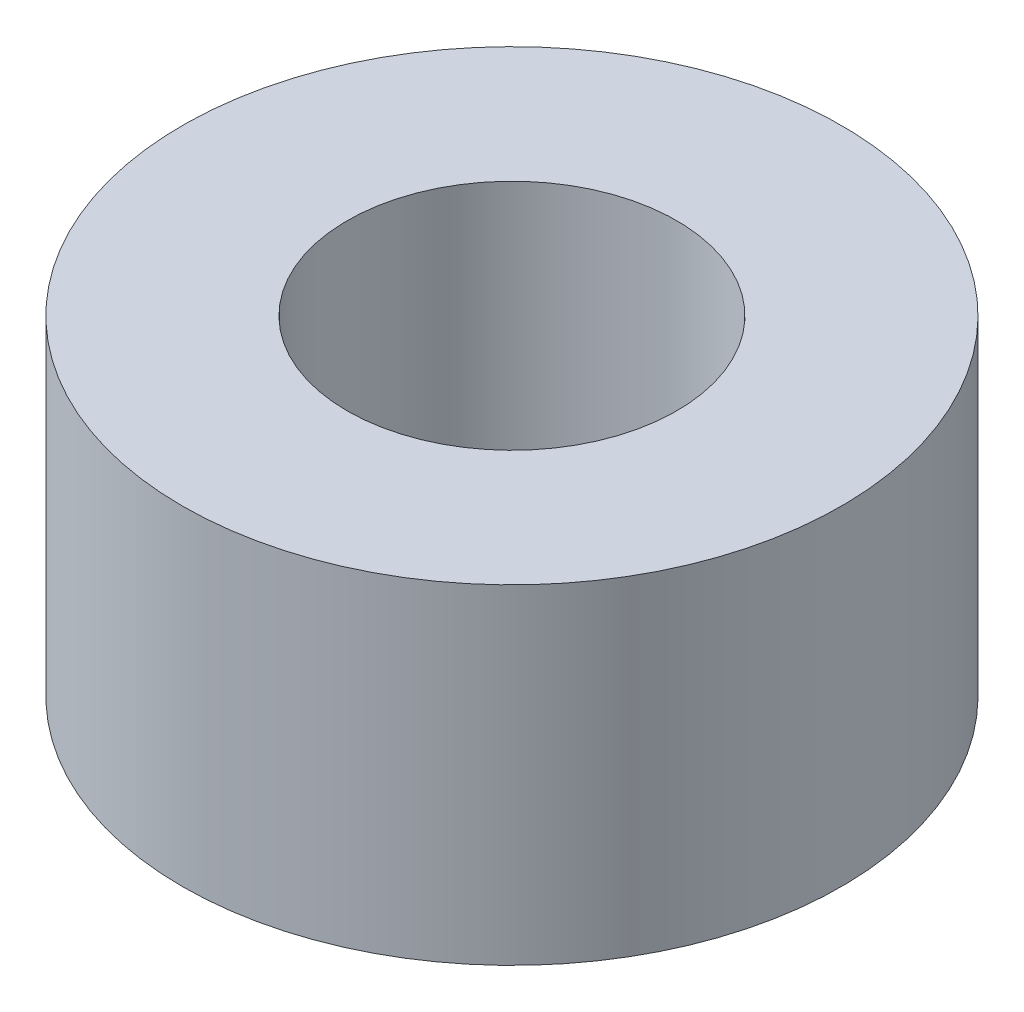
ISO-10303-21;
HEADER;
FILE_DESCRIPTION(('STEP AP214'),'2;1');
FILE_NAME('part.step','',(''),(''),'','','');
FILE_SCHEMA(('AUTOMOTIVE_DESIGN { 1 0 10303 214 1 1 1 1 }'));
ENDSEC;
DATA;
#1=APPLICATION_CONTEXT('core data for automotive mechanical design processes');
#2=APPLICATION_PROTOCOL_DEFINITION('international standard','automotive_design',2000,#1);
#3=PRODUCT_CONTEXT('',#1,'mechanical');
#4=PRODUCT('Part','Part','',(#3));
#5=PRODUCT_RELATED_PRODUCT_CATEGORY('part','',(#4));
#6=PRODUCT_DEFINITION_FORMATION('','',#4);
#7=PRODUCT_DEFINITION_CONTEXT('part definition',#1,'design');
#8=PRODUCT_DEFINITION('design','',#6,#7);
#9=PRODUCT_DEFINITION_SHAPE('','',#8);
#10=(LENGTH_UNIT() NAMED_UNIT(*) SI_UNIT(.MILLI.,.METRE.));
#11=(NAMED_UNIT(*) PLANE_ANGLE_UNIT() SI_UNIT($,.RADIAN.));
#12=(NAMED_UNIT(*) SI_UNIT($,.STERADIAN.) SOLID_ANGLE_UNIT());
#13=UNCERTAINTY_MEASURE_WITH_UNIT(LENGTH_MEASURE(1.E-05),#10,'distance_accuracy_value','');
#14=(GEOMETRIC_REPRESENTATION_CONTEXT(3) GLOBAL_UNCERTAINTY_ASSIGNED_CONTEXT((#13)) GLOBAL_UNIT_ASSIGNED_CONTEXT((#10,
#11,#12)) REPRESENTATION_CONTEXT('',''));
#15=CARTESIAN_POINT('',(0.,0.,0.));
#16=DIRECTION('',(0.,0.,1.));
#17=DIRECTION('',(1.,0.,0.));
#18=AXIS2_PLACEMENT_3D('',#15,#16,#17);
#19=CARTESIAN_POINT('',(0.,4.,0.));
#20=DIRECTION('',(0.,1.,0.));
#21=DIRECTION('',(0.,0.,1.));
#22=AXIS2_PLACEMENT_3D('',#19,#20,#21);
#23=PLANE('',#22);
#24=CARTESIAN_POINT('',(0.,4.,0.));
#25=DIRECTION('',(0.,1.,0.));
#26=DIRECTION('',(0.,0.,1.));
#27=AXIS2_PLACEMENT_3D('',#24,#25,#26);
#28=CIRCLE('',#27,4.);
#29=CARTESIAN_POINT('',(0.,4.,4.));
#30=VERTEX_POINT('',#29);
#31=EDGE_CURVE('E10',#30,#30,#28,.T.);
#32=ORIENTED_EDGE('',*,*,#31,.T.);
#33=EDGE_LOOP('',(#32));
#34=FACE_BOUND('',#33,.T.);
#35=CARTESIAN_POINT('',(0.,4.,0.));
#36=DIRECTION('',(0.,1.,0.));
#37=DIRECTION('',(0.,0.,1.));
#38=AXIS2_PLACEMENT_3D('',#35,#36,#37);
#39=CIRCLE('',#38,2.);
#40=CARTESIAN_POINT('',(0.,4.,2.));
#41=VERTEX_POINT('',#40);
#42=EDGE_CURVE('E43',#41,#41,#39,.T.);
#43=ORIENTED_EDGE('',*,*,#42,.F.);
#44=EDGE_LOOP('',(#43));
#45=FACE_BOUND('',#44,.T.);
#46=ADVANCED_FACE('F32',(#34,#45),#23,.T.);
#47=CARTESIAN_POINT('',(0.,0.,0.));
#48=DIRECTION('',(0.,1.,0.));
#49=DIRECTION('',(0.,0.,1.));
#50=AXIS2_PLACEMENT_3D('',#47,#48,#49);
#51=PLANE('',#50);
#52=CARTESIAN_POINT('',(0.,0.,0.));
#53=DIRECTION('',(0.,1.,0.));
#54=DIRECTION('',(0.,0.,1.));
#55=AXIS2_PLACEMENT_3D('',#52,#53,#54);
#56=CIRCLE('',#55,4.);
#57=CARTESIAN_POINT('',(0.,0.,4.));
#58=VERTEX_POINT('',#57);
#59=EDGE_CURVE('E36',#58,#58,#56,.T.);
#60=ORIENTED_EDGE('',*,*,#59,.F.);
#61=EDGE_LOOP('',(#60));
#62=FACE_BOUND('',#61,.T.);
#63=CARTESIAN_POINT('',(0.,0.,0.));
#64=DIRECTION('',(0.,1.,0.));
#65=DIRECTION('',(0.,0.,1.));
#66=AXIS2_PLACEMENT_3D('',#63,#64,#65);
#67=CIRCLE('',#66,2.);
#68=CARTESIAN_POINT('',(0.,0.,2.));
#69=VERTEX_POINT('',#68);
#70=EDGE_CURVE('E45',#69,#69,#67,.T.);
#71=ORIENTED_EDGE('',*,*,#70,.T.);
#72=EDGE_LOOP('',(#71));
#73=FACE_BOUND('',#72,.T.);
#74=ADVANCED_FACE('F55',(#62,#73),#51,.F.);
#75=CARTESIAN_POINT('',(0.,4.,0.));
#76=DIRECTION('',(0.,-1.,0.));
#77=DIRECTION('',(0.,0.,-1.));
#78=AXIS2_PLACEMENT_3D('',#75,#76,#77);
#79=CYLINDRICAL_SURFACE('',#78,4.);
#80=ORIENTED_EDGE('',*,*,#31,.F.);
#81=EDGE_LOOP('',(#80));
#82=FACE_BOUND('',#81,.T.);
#83=ORIENTED_EDGE('',*,*,#59,.T.);
#84=EDGE_LOOP('',(#83));
#85=FACE_BOUND('',#84,.T.);
#86=ADVANCED_FACE('F34',(#82,#85),#79,.T.);
#87=CARTESIAN_POINT('',(0.,4.,0.));
#88=DIRECTION('',(0.,-1.,0.));
#89=DIRECTION('',(0.,0.,-1.));
#90=AXIS2_PLACEMENT_3D('',#87,#88,#89);
#91=CYLINDRICAL_SURFACE('',#90,2.);
#92=ORIENTED_EDGE('',*,*,#42,.T.);
#93=EDGE_LOOP('',(#92));
#94=FACE_BOUND('',#93,.T.);
#95=ORIENTED_EDGE('',*,*,#70,.F.);
#96=EDGE_LOOP('',(#95));
#97=FACE_BOUND('',#96,.T.);
#98=ADVANCED_FACE('F51',(#94,#97),#91,.F.);
#99=CLOSED_SHELL('',(#46,#74,#86,#98));
#100=MANIFOLD_SOLID_BREP('B2',#99);
#101=ADVANCED_BREP_SHAPE_REPRESENTATION('',(#18,#100),#14);
#102=SHAPE_DEFINITION_REPRESENTATION(#9,#101);
ENDSEC;
END-ISO-10303-21;
